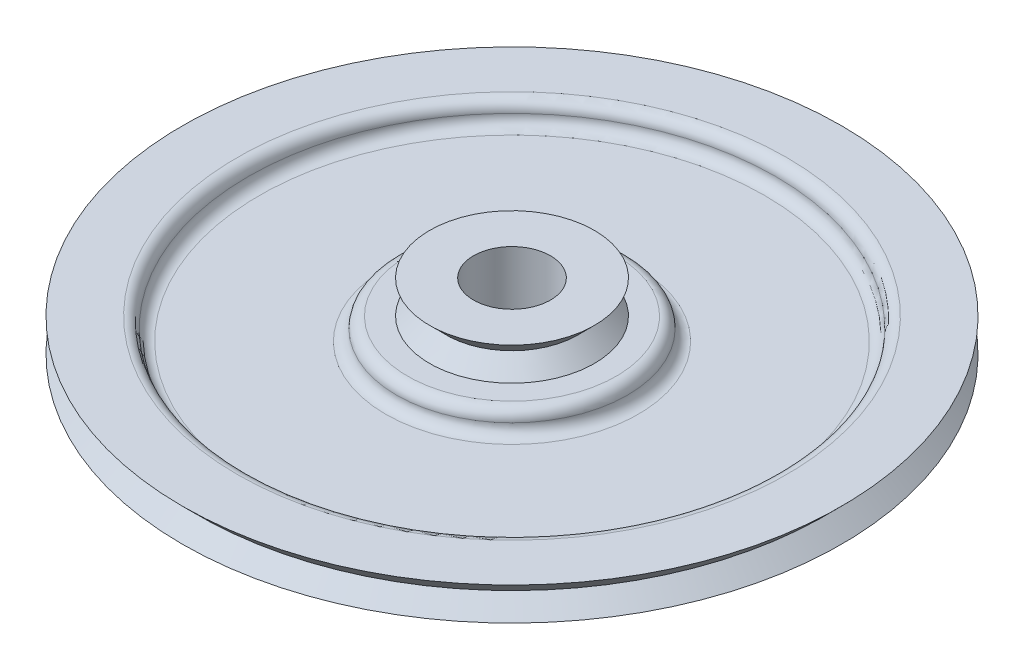
ISO-10303-21;
HEADER;
FILE_DESCRIPTION(('STEP AP214'),'2;1');
FILE_NAME('part.step','',(''),(''),'','','');
FILE_SCHEMA(('AUTOMOTIVE_DESIGN { 1 0 10303 214 1 1 1 1 }'));
ENDSEC;
DATA;
#1=APPLICATION_CONTEXT('core data for automotive mechanical design processes');
#2=APPLICATION_PROTOCOL_DEFINITION('international standard','automotive_design',2000,#1);
#3=PRODUCT_CONTEXT('',#1,'mechanical');
#4=PRODUCT('Part','Part','',(#3));
#5=PRODUCT_RELATED_PRODUCT_CATEGORY('part','',(#4));
#6=PRODUCT_DEFINITION_FORMATION('','',#4);
#7=PRODUCT_DEFINITION_CONTEXT('part definition',#1,'design');
#8=PRODUCT_DEFINITION('design','',#6,#7);
#9=PRODUCT_DEFINITION_SHAPE('','',#8);
#10=(LENGTH_UNIT() NAMED_UNIT(*) SI_UNIT(.MILLI.,.METRE.));
#11=(NAMED_UNIT(*) PLANE_ANGLE_UNIT() SI_UNIT($,.RADIAN.));
#12=(NAMED_UNIT(*) SI_UNIT($,.STERADIAN.) SOLID_ANGLE_UNIT());
#13=UNCERTAINTY_MEASURE_WITH_UNIT(LENGTH_MEASURE(1.E-05),#10,'distance_accuracy_value','');
#14=(GEOMETRIC_REPRESENTATION_CONTEXT(3) GLOBAL_UNCERTAINTY_ASSIGNED_CONTEXT((#13)) GLOBAL_UNIT_ASSIGNED_CONTEXT((#10,
#11,#12)) REPRESENTATION_CONTEXT('',''));
#15=CARTESIAN_POINT('',(0.,0.,0.));
#16=DIRECTION('',(0.,0.,1.));
#17=DIRECTION('',(1.,0.,0.));
#18=AXIS2_PLACEMENT_3D('',#15,#16,#17);
#19=CARTESIAN_POINT('',(-30.,2.99999999999998,0.));
#20=DIRECTION('',(0.,-1.,0.));
#21=DIRECTION('',(0.,0.,-1.));
#22=AXIS2_PLACEMENT_3D('',#19,#20,#21);
#23=PLANE('',#22);
#24=CARTESIAN_POINT('',(0.,2.99999999999998,0.));
#25=DIRECTION('',(0.,-1.,0.));
#26=DIRECTION('',(0.,0.,-1.));
#27=AXIS2_PLACEMENT_3D('',#24,#25,#26);
#28=CIRCLE('',#27,9.5);
#29=CARTESIAN_POINT('',(0.,2.99999999999998,-9.5));
#30=VERTEX_POINT('',#29);
#31=EDGE_CURVE('E127',#30,#30,#28,.F.);
#32=ORIENTED_EDGE('',*,*,#31,.T.);
#33=EDGE_LOOP('',(#32));
#34=FACE_BOUND('',#33,.T.);
#35=CARTESIAN_POINT('',(0.,2.99999999999999,0.));
#36=DIRECTION('',(0.,-1.,0.));
#37=DIRECTION('',(0.,0.,-1.));
#38=AXIS2_PLACEMENT_3D('',#35,#36,#37);
#39=CIRCLE('',#38,7.49999999999999);
#40=CARTESIAN_POINT('',(0.,2.99999999999999,-7.49999999999999));
#41=VERTEX_POINT('',#40);
#42=EDGE_CURVE('E108',#41,#41,#39,.T.);
#43=ORIENTED_EDGE('',*,*,#42,.T.);
#44=EDGE_LOOP('',(#43));
#45=FACE_BOUND('',#44,.T.);
#46=ADVANCED_FACE('F37',(#34,#45),#23,.F.);
#47=CARTESIAN_POINT('',(-3.5,0.,0.));
#48=DIRECTION('',(0.,1.,0.));
#49=DIRECTION('',(0.,0.,1.));
#50=AXIS2_PLACEMENT_3D('',#47,#48,#49);
#51=PLANE('',#50);
#52=CARTESIAN_POINT('',(0.,0.,0.));
#53=DIRECTION('',(0.,-1.,0.));
#54=DIRECTION('',(0.,0.,-1.));
#55=AXIS2_PLACEMENT_3D('',#52,#53,#54);
#56=CIRCLE('',#55,3.5);
#57=CARTESIAN_POINT('',(0.,0.,-3.5));
#58=VERTEX_POINT('',#57);
#59=EDGE_CURVE('E124',#58,#58,#56,.T.);
#60=ORIENTED_EDGE('',*,*,#59,.F.);
#61=EDGE_LOOP('',(#60));
#62=FACE_BOUND('',#61,.T.);
#63=CARTESIAN_POINT('',(0.,-1.48791653629975E-13,0.));
#64=DIRECTION('',(0.,-1.,0.));
#65=DIRECTION('',(0.,0.,-1.));
#66=AXIS2_PLACEMENT_3D('',#63,#64,#65);
#67=CIRCLE('',#66,30.);
#68=CARTESIAN_POINT('',(0.,-1.48791653629975E-13,-30.));
#69=VERTEX_POINT('',#68);
#70=EDGE_CURVE('E55',#69,#69,#67,.T.);
#71=ORIENTED_EDGE('',*,*,#70,.T.);
#72=EDGE_LOOP('',(#71));
#73=FACE_BOUND('',#72,.T.);
#74=ADVANCED_FACE('F78',(#62,#73),#51,.F.);
#75=CARTESIAN_POINT('',(0.,0.,0.));
#76=DIRECTION('',(0.,-1.,0.));
#77=DIRECTION('',(0.,0.,-1.));
#78=AXIS2_PLACEMENT_3D('',#75,#76,#77);
#79=CYLINDRICAL_SURFACE('',#78,3.5);
#80=CARTESIAN_POINT('',(0.,6.00000000000003,0.));
#81=DIRECTION('',(0.,-1.,0.));
#82=DIRECTION('',(0.,0.,-1.));
#83=AXIS2_PLACEMENT_3D('',#80,#81,#82);
#84=CIRCLE('',#83,3.5);
#85=CARTESIAN_POINT('',(0.,6.00000000000003,-3.5));
#86=VERTEX_POINT('',#85);
#87=EDGE_CURVE('E121',#86,#86,#84,.T.);
#88=ORIENTED_EDGE('',*,*,#87,.F.);
#89=EDGE_LOOP('',(#88));
#90=FACE_BOUND('',#89,.T.);
#91=ORIENTED_EDGE('',*,*,#59,.T.);
#92=EDGE_LOOP('',(#91));
#93=FACE_BOUND('',#92,.T.);
#94=ADVANCED_FACE('F85',(#90,#93),#79,.F.);
#95=CARTESIAN_POINT('',(-7.5,6.00000000000003,0.));
#96=DIRECTION('',(0.,-1.,0.));
#97=DIRECTION('',(0.,0.,-1.));
#98=AXIS2_PLACEMENT_3D('',#95,#96,#97);
#99=PLANE('',#98);
#100=CARTESIAN_POINT('',(0.,6.00000000000003,0.));
#101=DIRECTION('',(0.,-1.,0.));
#102=DIRECTION('',(0.,0.,-1.));
#103=AXIS2_PLACEMENT_3D('',#100,#101,#102);
#104=CIRCLE('',#103,7.5);
#105=CARTESIAN_POINT('',(0.,6.00000000000003,-7.5));
#106=VERTEX_POINT('',#105);
#107=EDGE_CURVE('E118',#106,#106,#104,.T.);
#108=ORIENTED_EDGE('',*,*,#107,.F.);
#109=EDGE_LOOP('',(#108));
#110=FACE_BOUND('',#109,.T.);
#111=ORIENTED_EDGE('',*,*,#87,.T.);
#112=EDGE_LOOP('',(#111));
#113=FACE_BOUND('',#112,.T.);
#114=ADVANCED_FACE('F170',(#110,#113),#99,.F.);
#115=CARTESIAN_POINT('',(0.,6.00000000000003,0.));
#116=DIRECTION('',(0.,1.,0.));
#117=DIRECTION('',(0.,0.,1.));
#118=AXIS2_PLACEMENT_3D('',#115,#116,#117);
#119=CONICAL_SURFACE('',#118,7.5,0.785398163397437);
#120=CARTESIAN_POINT('',(0.,4.49999999999999,0.));
#121=DIRECTION('',(0.,-1.,0.));
#122=DIRECTION('',(0.,0.,-1.));
#123=AXIS2_PLACEMENT_3D('',#120,#121,#122);
#124=CIRCLE('',#123,5.99999999999999);
#125=CARTESIAN_POINT('',(0.,4.49999999999999,-5.99999999999999));
#126=VERTEX_POINT('',#125);
#127=EDGE_CURVE('E111',#126,#126,#124,.T.);
#128=ORIENTED_EDGE('',*,*,#127,.F.);
#129=EDGE_LOOP('',(#128));
#130=FACE_BOUND('',#129,.T.);
#131=ORIENTED_EDGE('',*,*,#107,.T.);
#132=EDGE_LOOP('',(#131));
#133=FACE_BOUND('',#132,.T.);
#134=ADVANCED_FACE('F101',(#130,#133),#119,.T.);
#135=CARTESIAN_POINT('',(0.,4.49999999999999,0.));
#136=DIRECTION('',(0.,-1.,0.));
#137=DIRECTION('',(0.,0.,-1.));
#138=AXIS2_PLACEMENT_3D('',#135,#136,#137);
#139=CONICAL_SURFACE('',#138,5.99999999999999,0.785398163397444);
#140=ORIENTED_EDGE('',*,*,#42,.F.);
#141=EDGE_LOOP('',(#140));
#142=FACE_BOUND('',#141,.T.);
#143=ORIENTED_EDGE('',*,*,#127,.T.);
#144=EDGE_LOOP('',(#143));
#145=FACE_BOUND('',#144,.T.);
#146=ADVANCED_FACE('F94',(#142,#145),#139,.T.);
#147=CARTESIAN_POINT('',(0.,2.99999999999998,0.));
#148=DIRECTION('',(0.,-1.,0.));
#149=DIRECTION('',(0.,0.,-1.));
#150=AXIS2_PLACEMENT_3D('',#147,#148,#149);
#151=CIRCLE('',#150,25.);
#152=CARTESIAN_POINT('',(0.,2.99999999999998,-25.));
#153=VERTEX_POINT('',#152);
#154=EDGE_CURVE('E11',#153,#153,#151,.T.);
#155=ORIENTED_EDGE('',*,*,#154,.T.);
#156=EDGE_LOOP('',(#155));
#157=FACE_BOUND('',#156,.T.);
#158=CARTESIAN_POINT('',(0.,2.99999999999998,0.));
#159=DIRECTION('',(0.,-1.,0.));
#160=DIRECTION('',(0.,0.,-1.));
#161=AXIS2_PLACEMENT_3D('',#158,#159,#160);
#162=CIRCLE('',#161,30.);
#163=CARTESIAN_POINT('',(0.,2.99999999999998,-30.));
#164=VERTEX_POINT('',#163);
#165=EDGE_CURVE('E106',#164,#164,#162,.T.);
#166=ORIENTED_EDGE('',*,*,#165,.F.);
#167=EDGE_LOOP('',(#166));
#168=FACE_BOUND('',#167,.T.);
#169=ADVANCED_FACE('F81',(#157,#168),#23,.F.);
#170=CARTESIAN_POINT('',(0.,2.99999999999998,0.));
#171=DIRECTION('',(0.,1.,0.));
#172=DIRECTION('',(0.,0.,1.));
#173=AXIS2_PLACEMENT_3D('',#170,#171,#172);
#174=CONICAL_SURFACE('',#173,30.,0.78539816339741);
#175=CARTESIAN_POINT('',(0.,1.49999999999986,0.));
#176=DIRECTION('',(0.,-1.,0.));
#177=DIRECTION('',(0.,0.,-1.));
#178=AXIS2_PLACEMENT_3D('',#175,#176,#177);
#179=CIRCLE('',#178,28.5);
#180=CARTESIAN_POINT('',(0.,1.49999999999986,-28.5));
#181=VERTEX_POINT('',#180);
#182=EDGE_CURVE('E59',#181,#181,#179,.T.);
#183=ORIENTED_EDGE('',*,*,#182,.F.);
#184=EDGE_LOOP('',(#183));
#185=FACE_BOUND('',#184,.T.);
#186=ORIENTED_EDGE('',*,*,#165,.T.);
#187=EDGE_LOOP('',(#186));
#188=FACE_BOUND('',#187,.T.);
#189=ADVANCED_FACE('F93',(#185,#188),#174,.T.);
#190=CARTESIAN_POINT('',(0.,1.49999999999986,0.));
#191=DIRECTION('',(0.,-1.,0.));
#192=DIRECTION('',(0.,0.,-1.));
#193=AXIS2_PLACEMENT_3D('',#190,#191,#192);
#194=CONICAL_SURFACE('',#193,28.5,0.785398163397444);
#195=ORIENTED_EDGE('',*,*,#70,.F.);
#196=EDGE_LOOP('',(#195));
#197=FACE_BOUND('',#196,.T.);
#198=ORIENTED_EDGE('',*,*,#182,.T.);
#199=EDGE_LOOP('',(#198));
#200=FACE_BOUND('',#199,.T.);
#201=ADVANCED_FACE('F99',(#197,#200),#194,.T.);
#202=CARTESIAN_POINT('',(-3.5,0.999999999999926,0.));
#203=DIRECTION('',(0.,1.,0.));
#204=DIRECTION('',(0.,0.,1.));
#205=AXIS2_PLACEMENT_3D('',#202,#203,#204);
#206=PLANE('',#205);
#207=CARTESIAN_POINT('',(0.,0.999999999999926,0.));
#208=DIRECTION('',(0.,1.,0.));
#209=DIRECTION('',(0.,0.,1.));
#210=AXIS2_PLACEMENT_3D('',#207,#208,#209);
#211=CIRCLE('',#210,11.5);
#212=CARTESIAN_POINT('',(0.,0.999999999999926,11.5));
#213=VERTEX_POINT('',#212);
#214=EDGE_CURVE('E45',#213,#213,#211,.F.);
#215=ORIENTED_EDGE('',*,*,#214,.T.);
#216=EDGE_LOOP('',(#215));
#217=FACE_BOUND('',#216,.T.);
#218=CARTESIAN_POINT('',(0.,0.999999999999926,0.));
#219=DIRECTION('',(0.,1.,0.));
#220=DIRECTION('',(0.,0.,1.));
#221=AXIS2_PLACEMENT_3D('',#218,#219,#220);
#222=CIRCLE('',#221,23.);
#223=CARTESIAN_POINT('',(0.,0.999999999999926,23.));
#224=VERTEX_POINT('',#223);
#225=EDGE_CURVE('E50',#224,#224,#222,.T.);
#226=ORIENTED_EDGE('',*,*,#225,.T.);
#227=EDGE_LOOP('',(#226));
#228=FACE_BOUND('',#227,.T.);
#229=ADVANCED_FACE('F130',(#217,#228),#206,.T.);
#230=CARTESIAN_POINT('',(0.,1.99999999999992,0.));
#231=DIRECTION('',(0.,1.,0.));
#232=DIRECTION('',(0.,0.,1.));
#233=AXIS2_PLACEMENT_3D('',#230,#231,#232);
#234=TOROIDAL_SURFACE('',#233,11.5,1.);
#235=ORIENTED_EDGE('',*,*,#214,.F.);
#236=EDGE_LOOP('',(#235));
#237=FACE_BOUND('',#236,.T.);
#238=CARTESIAN_POINT('',(0.,1.99999999999992,0.));
#239=DIRECTION('',(0.,1.,0.));
#240=DIRECTION('',(0.,0.,1.));
#241=AXIS2_PLACEMENT_3D('',#238,#239,#240);
#242=CIRCLE('',#241,10.5);
#243=CARTESIAN_POINT('',(0.,1.99999999999992,10.5));
#244=VERTEX_POINT('',#243);
#245=EDGE_CURVE('E53',#244,#244,#242,.T.);
#246=ORIENTED_EDGE('',*,*,#245,.F.);
#247=EDGE_LOOP('',(#246));
#248=FACE_BOUND('',#247,.T.);
#249=ADVANCED_FACE('F74',(#237,#248),#234,.F.);
#250=CARTESIAN_POINT('',(0.,1.99999999999999,0.));
#251=DIRECTION('',(0.,-1.,0.));
#252=DIRECTION('',(0.,0.,-1.));
#253=AXIS2_PLACEMENT_3D('',#250,#251,#252);
#254=TOROIDAL_SURFACE('',#253,9.5,1.);
#255=ORIENTED_EDGE('',*,*,#245,.T.);
#256=EDGE_LOOP('',(#255));
#257=FACE_BOUND('',#256,.T.);
#258=ORIENTED_EDGE('',*,*,#31,.F.);
#259=EDGE_LOOP('',(#258));
#260=FACE_BOUND('',#259,.T.);
#261=ADVANCED_FACE('F67',(#257,#260),#254,.T.);
#262=CARTESIAN_POINT('',(0.,1.99999999999992,0.));
#263=DIRECTION('',(0.,1.,0.));
#264=DIRECTION('',(0.,0.,1.));
#265=AXIS2_PLACEMENT_3D('',#262,#263,#264);
#266=TOROIDAL_SURFACE('',#265,23.,1.);
#267=ORIENTED_EDGE('',*,*,#225,.F.);
#268=EDGE_LOOP('',(#267));
#269=FACE_BOUND('',#268,.T.);
#270=CARTESIAN_POINT('',(0.,1.99999999999992,0.));
#271=DIRECTION('',(0.,1.,0.));
#272=DIRECTION('',(0.,0.,1.));
#273=AXIS2_PLACEMENT_3D('',#270,#271,#272);
#274=CIRCLE('',#273,24.);
#275=CARTESIAN_POINT('',(0.,1.99999999999992,24.));
#276=VERTEX_POINT('',#275);
#277=EDGE_CURVE('E41',#276,#276,#274,.F.);
#278=ORIENTED_EDGE('',*,*,#277,.F.);
#279=EDGE_LOOP('',(#278));
#280=FACE_BOUND('',#279,.T.);
#281=ADVANCED_FACE('F39',(#269,#280),#266,.F.);
#282=CARTESIAN_POINT('',(0.,1.99999999999999,0.));
#283=DIRECTION('',(0.,-1.,0.));
#284=DIRECTION('',(0.,0.,-1.));
#285=AXIS2_PLACEMENT_3D('',#282,#283,#284);
#286=TOROIDAL_SURFACE('',#285,25.,1.);
#287=ORIENTED_EDGE('',*,*,#154,.F.);
#288=EDGE_LOOP('',(#287));
#289=FACE_BOUND('',#288,.T.);
#290=ORIENTED_EDGE('',*,*,#277,.T.);
#291=EDGE_LOOP('',(#290));
#292=FACE_BOUND('',#291,.T.);
#293=ADVANCED_FACE('F64',(#289,#292),#286,.T.);
#294=CLOSED_SHELL('',(#46,#74,#94,#114,#134,#146,#169,#189,#201,#229,#249,#261,#281,#293));
#295=MANIFOLD_SOLID_BREP('B2',#294);
#296=ADVANCED_BREP_SHAPE_REPRESENTATION('',(#18,#295),#14);
#297=SHAPE_DEFINITION_REPRESENTATION(#9,#296);
ENDSEC;
END-ISO-10303-21;
